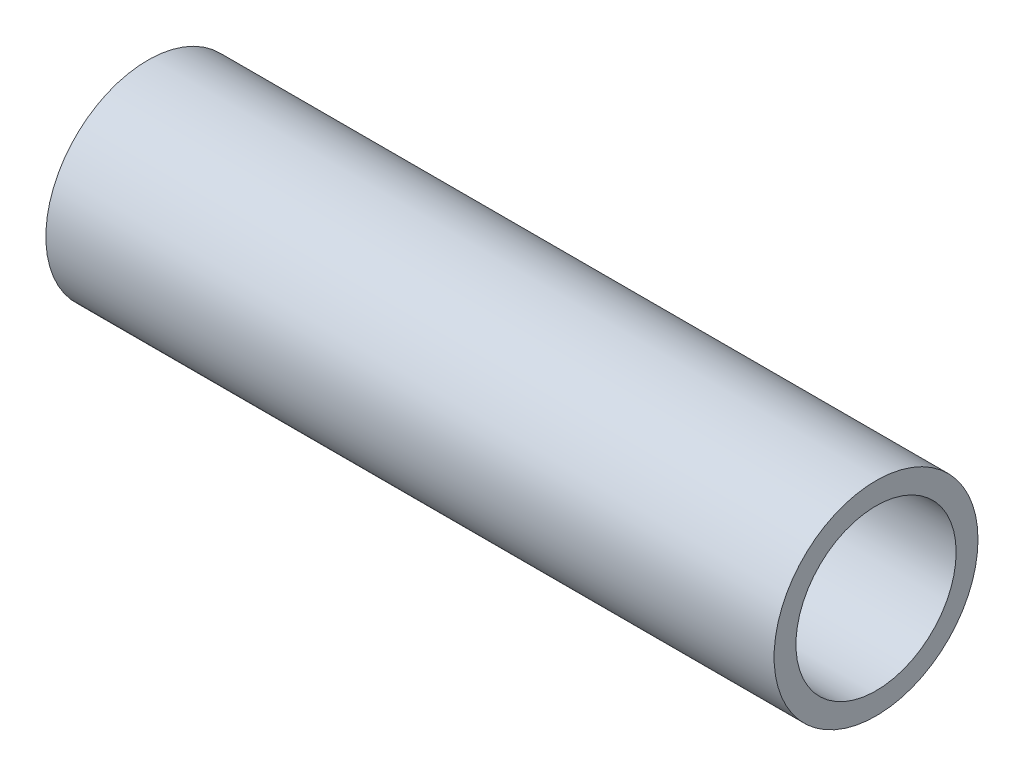
ISO-10303-21;
HEADER;
FILE_DESCRIPTION(('STEP AP214'),'2;1');
FILE_NAME('part.step','',(''),(''),'','','');
FILE_SCHEMA(('AUTOMOTIVE_DESIGN { 1 0 10303 214 1 1 1 1 }'));
ENDSEC;
DATA;
#1=APPLICATION_CONTEXT('core data for automotive mechanical design processes');
#2=APPLICATION_PROTOCOL_DEFINITION('international standard','automotive_design',2000,#1);
#3=PRODUCT_CONTEXT('',#1,'mechanical');
#4=PRODUCT('Part','Part','',(#3));
#5=PRODUCT_RELATED_PRODUCT_CATEGORY('part','',(#4));
#6=PRODUCT_DEFINITION_FORMATION('','',#4);
#7=PRODUCT_DEFINITION_CONTEXT('part definition',#1,'design');
#8=PRODUCT_DEFINITION('design','',#6,#7);
#9=PRODUCT_DEFINITION_SHAPE('','',#8);
#10=(LENGTH_UNIT() NAMED_UNIT(*) SI_UNIT(.MILLI.,.METRE.));
#11=(NAMED_UNIT(*) PLANE_ANGLE_UNIT() SI_UNIT($,.RADIAN.));
#12=(NAMED_UNIT(*) SI_UNIT($,.STERADIAN.) SOLID_ANGLE_UNIT());
#13=UNCERTAINTY_MEASURE_WITH_UNIT(LENGTH_MEASURE(1.E-05),#10,'distance_accuracy_value','');
#14=(GEOMETRIC_REPRESENTATION_CONTEXT(3) GLOBAL_UNCERTAINTY_ASSIGNED_CONTEXT((#13)) GLOBAL_UNIT_ASSIGNED_CONTEXT((#10,
#11,#12)) REPRESENTATION_CONTEXT('',''));
#15=CARTESIAN_POINT('',(0.,0.,0.));
#16=DIRECTION('',(0.,0.,1.));
#17=DIRECTION('',(1.,0.,0.));
#18=AXIS2_PLACEMENT_3D('',#15,#16,#17);
#19=CARTESIAN_POINT('',(50.,0.,0.));
#20=DIRECTION('',(1.,0.,0.));
#21=DIRECTION('',(0.,0.,-1.));
#22=AXIS2_PLACEMENT_3D('',#19,#20,#21);
#23=PLANE('',#22);
#24=CARTESIAN_POINT('',(50.,0.,0.));
#25=DIRECTION('',(1.,0.,0.));
#26=DIRECTION('',(0.,0.,-1.));
#27=AXIS2_PLACEMENT_3D('',#24,#25,#26);
#28=CIRCLE('',#27,14.);
#29=CARTESIAN_POINT('',(50.,0.,-14.));
#30=VERTEX_POINT('',#29);
#31=EDGE_CURVE('E10',#30,#30,#28,.T.);
#32=ORIENTED_EDGE('',*,*,#31,.T.);
#33=EDGE_LOOP('',(#32));
#34=FACE_BOUND('',#33,.T.);
#35=CARTESIAN_POINT('',(50.,0.,0.));
#36=DIRECTION('',(1.,0.,0.));
#37=DIRECTION('',(0.,0.,-1.));
#38=AXIS2_PLACEMENT_3D('',#35,#36,#37);
#39=CIRCLE('',#38,11.);
#40=CARTESIAN_POINT('',(50.,0.,-11.));
#41=VERTEX_POINT('',#40);
#42=EDGE_CURVE('E48',#41,#41,#39,.T.);
#43=ORIENTED_EDGE('',*,*,#42,.F.);
#44=EDGE_LOOP('',(#43));
#45=FACE_BOUND('',#44,.T.);
#46=ADVANCED_FACE('F35',(#34,#45),#23,.T.);
#47=CARTESIAN_POINT('',(-50.,0.,0.));
#48=DIRECTION('',(1.,0.,0.));
#49=DIRECTION('',(0.,0.,-1.));
#50=AXIS2_PLACEMENT_3D('',#47,#48,#49);
#51=PLANE('',#50);
#52=CARTESIAN_POINT('',(-50.,0.,0.));
#53=DIRECTION('',(1.,0.,0.));
#54=DIRECTION('',(0.,0.,-1.));
#55=AXIS2_PLACEMENT_3D('',#52,#53,#54);
#56=CIRCLE('',#55,14.);
#57=CARTESIAN_POINT('',(-50.,0.,-14.));
#58=VERTEX_POINT('',#57);
#59=EDGE_CURVE('E39',#58,#58,#56,.T.);
#60=ORIENTED_EDGE('',*,*,#59,.F.);
#61=EDGE_LOOP('',(#60));
#62=FACE_BOUND('',#61,.T.);
#63=CARTESIAN_POINT('',(-50.,0.,0.));
#64=DIRECTION('',(1.,0.,0.));
#65=DIRECTION('',(0.,0.,-1.));
#66=AXIS2_PLACEMENT_3D('',#63,#64,#65);
#67=CIRCLE('',#66,11.);
#68=CARTESIAN_POINT('',(-50.,0.,-11.));
#69=VERTEX_POINT('',#68);
#70=EDGE_CURVE('E50',#69,#69,#67,.T.);
#71=ORIENTED_EDGE('',*,*,#70,.T.);
#72=EDGE_LOOP('',(#71));
#73=FACE_BOUND('',#72,.T.);
#74=ADVANCED_FACE('F62',(#62,#73),#51,.F.);
#75=CARTESIAN_POINT('',(50.,0.,0.));
#76=DIRECTION('',(-1.,0.,0.));
#77=DIRECTION('',(0.,0.,1.));
#78=AXIS2_PLACEMENT_3D('',#75,#76,#77);
#79=CYLINDRICAL_SURFACE('',#78,14.);
#80=ORIENTED_EDGE('',*,*,#31,.F.);
#81=EDGE_LOOP('',(#80));
#82=FACE_BOUND('',#81,.T.);
#83=ORIENTED_EDGE('',*,*,#59,.T.);
#84=EDGE_LOOP('',(#83));
#85=FACE_BOUND('',#84,.T.);
#86=ADVANCED_FACE('F37',(#82,#85),#79,.T.);
#87=CARTESIAN_POINT('',(50.,0.,0.));
#88=DIRECTION('',(-1.,0.,0.));
#89=DIRECTION('',(0.,0.,1.));
#90=AXIS2_PLACEMENT_3D('',#87,#88,#89);
#91=CYLINDRICAL_SURFACE('',#90,11.);
#92=ORIENTED_EDGE('',*,*,#42,.T.);
#93=EDGE_LOOP('',(#92));
#94=FACE_BOUND('',#93,.T.);
#95=ORIENTED_EDGE('',*,*,#70,.F.);
#96=EDGE_LOOP('',(#95));
#97=FACE_BOUND('',#96,.T.);
#98=ADVANCED_FACE('F58',(#94,#97),#91,.F.);
#99=CLOSED_SHELL('',(#46,#74,#86,#98));
#100=MANIFOLD_SOLID_BREP('B2',#99);
#101=ADVANCED_BREP_SHAPE_REPRESENTATION('',(#18,#100),#14);
#102=SHAPE_DEFINITION_REPRESENTATION(#9,#101);
ENDSEC;
END-ISO-10303-21;
